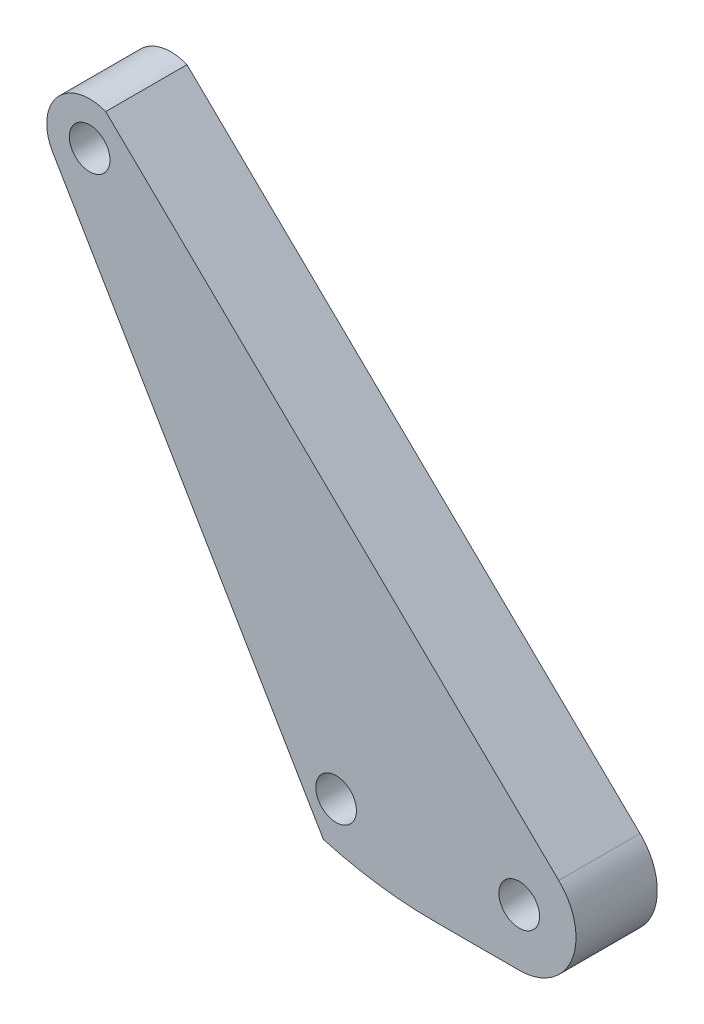
ISO-10303-21;
HEADER;
FILE_DESCRIPTION(('STEP AP214'),'2;1');
FILE_NAME('part.step','',(''),(''),'','','');
FILE_SCHEMA(('AUTOMOTIVE_DESIGN { 1 0 10303 214 1 1 1 1 }'));
ENDSEC;
DATA;
#1=APPLICATION_CONTEXT('core data for automotive mechanical design processes');
#2=APPLICATION_PROTOCOL_DEFINITION('international standard','automotive_design',2000,#1);
#3=PRODUCT_CONTEXT('',#1,'mechanical');
#4=PRODUCT('Part','Part','',(#3));
#5=PRODUCT_RELATED_PRODUCT_CATEGORY('part','',(#4));
#6=PRODUCT_DEFINITION_FORMATION('','',#4);
#7=PRODUCT_DEFINITION_CONTEXT('part definition',#1,'design');
#8=PRODUCT_DEFINITION('design','',#6,#7);
#9=PRODUCT_DEFINITION_SHAPE('','',#8);
#10=(LENGTH_UNIT() NAMED_UNIT(*) SI_UNIT(.MILLI.,.METRE.));
#11=(NAMED_UNIT(*) PLANE_ANGLE_UNIT() SI_UNIT($,.RADIAN.));
#12=(NAMED_UNIT(*) SI_UNIT($,.STERADIAN.) SOLID_ANGLE_UNIT());
#13=UNCERTAINTY_MEASURE_WITH_UNIT(LENGTH_MEASURE(1.E-05),#10,'distance_accuracy_value','');
#14=(GEOMETRIC_REPRESENTATION_CONTEXT(3) GLOBAL_UNCERTAINTY_ASSIGNED_CONTEXT((#13)) GLOBAL_UNIT_ASSIGNED_CONTEXT((#10,
#11,#12)) REPRESENTATION_CONTEXT('',''));
#15=CARTESIAN_POINT('',(0.,0.,0.));
#16=DIRECTION('',(0.,0.,1.));
#17=DIRECTION('',(1.,0.,0.));
#18=AXIS2_PLACEMENT_3D('',#15,#16,#17);
#19=CARTESIAN_POINT('',(-1.81475303851035,15.1962675797824,4.));
#20=DIRECTION('',(0.,0.,1.));
#21=DIRECTION('',(1.,0.,0.));
#22=AXIS2_PLACEMENT_3D('',#19,#20,#21);
#23=PLANE('',#22);
#24=CARTESIAN_POINT('',(2.36936185913628,-1.98601487246033,4.));
#25=DIRECTION('',(0.,0.,1.));
#26=DIRECTION('',(1.,0.,0.));
#27=AXIS2_PLACEMENT_3D('',#24,#25,#26);
#28=CIRCLE('',#27,1.);
#29=CARTESIAN_POINT('',(3.36936185913628,-1.98601487246033,4.));
#30=VERTEX_POINT('',#29);
#31=EDGE_CURVE('E183',#30,#30,#28,.T.);
#32=ORIENTED_EDGE('',*,*,#31,.F.);
#33=EDGE_LOOP('',(#32));
#34=FACE_BOUND('',#33,.T.);
#35=CARTESIAN_POINT('',(-1.81475303851035,15.1962675797824,4.));
#36=DIRECTION('',(0.,0.,1.));
#37=DIRECTION('',(1.,0.,0.));
#38=AXIS2_PLACEMENT_3D('',#35,#36,#37);
#39=CIRCLE('',#38,19.976772735065);
#40=CARTESIAN_POINT('',(-7.26548802719962,-4.02249765088515,4.));
#41=VERTEX_POINT('',#40);
#42=CARTESIAN_POINT('',(-1.81475303851033,-4.78050515528262,4.));
#43=VERTEX_POINT('',#42);
#44=EDGE_CURVE('E128',#41,#43,#39,.T.);
#45=ORIENTED_EDGE('',*,*,#44,.T.);
#46=DIRECTION('',(1.,0.,0.));
#47=VECTOR('',#46,1.);
#48=CARTESIAN_POINT('',(2.36936185913628,-4.78050515528262,4.));
#49=LINE('',#48,#47);
#50=CARTESIAN_POINT('',(2.36936185913628,-4.78050515528262,4.));
#51=VERTEX_POINT('',#50);
#52=EDGE_CURVE('E86',#43,#51,#49,.T.);
#53=ORIENTED_EDGE('',*,*,#52,.T.);
#54=CARTESIAN_POINT('',(2.36936185913628,-1.98601487246033,4.));
#55=DIRECTION('',(0.,0.,1.));
#56=DIRECTION('',(1.,0.,0.));
#57=AXIS2_PLACEMENT_3D('',#54,#55,#56);
#58=CIRCLE('',#57,2.79449028282229);
#59=CARTESIAN_POINT('',(4.31470222230882,0.0201822295712623,4.));
#60=VERTEX_POINT('',#59);
#61=EDGE_CURVE('E99',#51,#60,#58,.T.);
#62=ORIENTED_EDGE('',*,*,#61,.T.);
#63=DIRECTION('',(-0.717911640045294,0.696134237835977,0.));
#64=VECTOR('',#63,1.);
#65=CARTESIAN_POINT('',(-17.9779953156781,21.6366446802085,4.));
#66=LINE('',#65,#64);
#67=CARTESIAN_POINT('',(-17.9779953156781,21.6366446802085,4.));
#68=VERTEX_POINT('',#67);
#69=EDGE_CURVE('E93',#60,#68,#66,.T.);
#70=ORIENTED_EDGE('',*,*,#69,.T.);
#71=CARTESIAN_POINT('',(-18.7659280561654,19.6762430961428,4.));
#72=DIRECTION('',(0.,0.,1.));
#73=DIRECTION('',(1.,0.,0.));
#74=AXIS2_PLACEMENT_3D('',#71,#72,#73);
#75=CIRCLE('',#74,2.11282095179384);
#76=CARTESIAN_POINT('',(-20.5866446504047,18.6043273075658,4.));
#77=VERTEX_POINT('',#76);
#78=EDGE_CURVE('E97',#68,#77,#75,.T.);
#79=ORIENTED_EDGE('',*,*,#78,.T.);
#80=DIRECTION('',(0.507338678020431,-0.861746752697381,0.));
#81=VECTOR('',#80,1.);
#82=CARTESIAN_POINT('',(-20.5866446504047,18.6043273075658,4.));
#83=LINE('',#82,#81);
#84=EDGE_CURVE('E49',#77,#41,#83,.T.);
#85=ORIENTED_EDGE('',*,*,#84,.T.);
#86=EDGE_LOOP('',(#45,#53,#62,#70,#79,#85));
#87=FACE_BOUND('',#86,.T.);
#88=CARTESIAN_POINT('',(-6.64094739236276,-1.98601487246033,4.));
#89=DIRECTION('',(0.,0.,1.));
#90=DIRECTION('',(1.,0.,0.));
#91=AXIS2_PLACEMENT_3D('',#88,#89,#90);
#92=CIRCLE('',#91,1.);
#93=CARTESIAN_POINT('',(-5.64094739236276,-1.98601487246033,4.));
#94=VERTEX_POINT('',#93);
#95=EDGE_CURVE('E121',#94,#94,#92,.T.);
#96=ORIENTED_EDGE('',*,*,#95,.F.);
#97=EDGE_LOOP('',(#96));
#98=FACE_BOUND('',#97,.T.);
#99=CARTESIAN_POINT('',(-18.7659280561654,19.6762430961428,4.));
#100=DIRECTION('',(0.,0.,1.));
#101=DIRECTION('',(1.,0.,0.));
#102=AXIS2_PLACEMENT_3D('',#99,#100,#101);
#103=CIRCLE('',#102,1.);
#104=CARTESIAN_POINT('',(-17.7659280561654,19.6762430961428,4.));
#105=VERTEX_POINT('',#104);
#106=EDGE_CURVE('E174',#105,#105,#103,.T.);
#107=ORIENTED_EDGE('',*,*,#106,.F.);
#108=EDGE_LOOP('',(#107));
#109=FACE_BOUND('',#108,.T.);
#110=ADVANCED_FACE('F32',(#34,#87,#98,#109),#23,.T.);
#111=CARTESIAN_POINT('',(-1.81475303851035,15.1962675797824,0.));
#112=DIRECTION('',(0.,0.,1.));
#113=DIRECTION('',(1.,0.,0.));
#114=AXIS2_PLACEMENT_3D('',#111,#112,#113);
#115=PLANE('',#114);
#116=CARTESIAN_POINT('',(-1.81475303851035,15.1962675797824,0.));
#117=DIRECTION('',(0.,0.,1.));
#118=DIRECTION('',(1.,0.,0.));
#119=AXIS2_PLACEMENT_3D('',#116,#117,#118);
#120=CIRCLE('',#119,19.976772735065);
#121=CARTESIAN_POINT('',(-7.26548802719962,-4.02249765088515,0.));
#122=VERTEX_POINT('',#121);
#123=CARTESIAN_POINT('',(-1.81475303851033,-4.78050515528262,0.));
#124=VERTEX_POINT('',#123);
#125=EDGE_CURVE('E117',#122,#124,#120,.T.);
#126=ORIENTED_EDGE('',*,*,#125,.F.);
#127=DIRECTION('',(0.507338678020431,-0.861746752697381,0.));
#128=VECTOR('',#127,1.);
#129=CARTESIAN_POINT('',(-20.5866446504047,18.6043273075658,0.));
#130=LINE('',#129,#128);
#131=CARTESIAN_POINT('',(-20.5866446504047,18.6043273075658,0.));
#132=VERTEX_POINT('',#131);
#133=EDGE_CURVE('E78',#132,#122,#130,.T.);
#134=ORIENTED_EDGE('',*,*,#133,.F.);
#135=CARTESIAN_POINT('',(-18.7659280561654,19.6762430961428,0.));
#136=DIRECTION('',(0.,0.,1.));
#137=DIRECTION('',(1.,0.,0.));
#138=AXIS2_PLACEMENT_3D('',#135,#136,#137);
#139=CIRCLE('',#138,2.11282095179384);
#140=CARTESIAN_POINT('',(-17.9779953156781,21.6366446802085,0.));
#141=VERTEX_POINT('',#140);
#142=EDGE_CURVE('E72',#141,#132,#139,.T.);
#143=ORIENTED_EDGE('',*,*,#142,.F.);
#144=DIRECTION('',(-0.717911640045294,0.696134237835977,0.));
#145=VECTOR('',#144,1.);
#146=CARTESIAN_POINT('',(-17.9779953156781,21.6366446802085,0.));
#147=LINE('',#146,#145);
#148=CARTESIAN_POINT('',(4.31470222230882,0.0201822295712623,0.));
#149=VERTEX_POINT('',#148);
#150=EDGE_CURVE('E107',#149,#141,#147,.T.);
#151=ORIENTED_EDGE('',*,*,#150,.F.);
#152=CARTESIAN_POINT('',(2.36936185913628,-1.98601487246033,0.));
#153=DIRECTION('',(0.,0.,1.));
#154=DIRECTION('',(1.,0.,0.));
#155=AXIS2_PLACEMENT_3D('',#152,#153,#154);
#156=CIRCLE('',#155,2.79449028282229);
#157=CARTESIAN_POINT('',(2.36936185913628,-4.78050515528262,0.));
#158=VERTEX_POINT('',#157);
#159=EDGE_CURVE('E123',#158,#149,#156,.T.);
#160=ORIENTED_EDGE('',*,*,#159,.F.);
#161=DIRECTION('',(1.,0.,0.));
#162=VECTOR('',#161,1.);
#163=CARTESIAN_POINT('',(2.36936185913628,-4.78050515528262,0.));
#164=LINE('',#163,#162);
#165=EDGE_CURVE('E120',#124,#158,#164,.T.);
#166=ORIENTED_EDGE('',*,*,#165,.F.);
#167=EDGE_LOOP('',(#126,#134,#143,#151,#160,#166));
#168=FACE_BOUND('',#167,.T.);
#169=CARTESIAN_POINT('',(-6.64094739236276,-1.98601487246033,0.));
#170=DIRECTION('',(0.,0.,1.));
#171=DIRECTION('',(1.,0.,0.));
#172=AXIS2_PLACEMENT_3D('',#169,#170,#171);
#173=CIRCLE('',#172,1.);
#174=CARTESIAN_POINT('',(-5.64094739236276,-1.98601487246033,0.));
#175=VERTEX_POINT('',#174);
#176=EDGE_CURVE('E186',#175,#175,#173,.T.);
#177=ORIENTED_EDGE('',*,*,#176,.T.);
#178=EDGE_LOOP('',(#177));
#179=FACE_BOUND('',#178,.T.);
#180=CARTESIAN_POINT('',(2.36936185913628,-1.98601487246033,0.));
#181=DIRECTION('',(0.,0.,1.));
#182=DIRECTION('',(1.,0.,0.));
#183=AXIS2_PLACEMENT_3D('',#180,#181,#182);
#184=CIRCLE('',#183,1.);
#185=CARTESIAN_POINT('',(3.36936185913628,-1.98601487246033,0.));
#186=VERTEX_POINT('',#185);
#187=EDGE_CURVE('E180',#186,#186,#184,.T.);
#188=ORIENTED_EDGE('',*,*,#187,.T.);
#189=EDGE_LOOP('',(#188));
#190=FACE_BOUND('',#189,.T.);
#191=CARTESIAN_POINT('',(-18.7659280561654,19.6762430961428,0.));
#192=DIRECTION('',(0.,0.,1.));
#193=DIRECTION('',(1.,0.,0.));
#194=AXIS2_PLACEMENT_3D('',#191,#192,#193);
#195=CIRCLE('',#194,1.);
#196=CARTESIAN_POINT('',(-17.7659280561654,19.6762430961428,0.));
#197=VERTEX_POINT('',#196);
#198=EDGE_CURVE('E177',#197,#197,#195,.T.);
#199=ORIENTED_EDGE('',*,*,#198,.T.);
#200=EDGE_LOOP('',(#199));
#201=FACE_BOUND('',#200,.T.);
#202=ADVANCED_FACE('F137',(#168,#179,#190,#201),#115,.F.);
#203=CARTESIAN_POINT('',(-1.81475303851035,15.1962675797824,4.));
#204=DIRECTION('',(0.,0.,-1.));
#205=DIRECTION('',(-1.,0.,0.));
#206=AXIS2_PLACEMENT_3D('',#203,#204,#205);
#207=CYLINDRICAL_SURFACE('',#206,19.976772735065);
#208=ORIENTED_EDGE('',*,*,#125,.T.);
#209=DIRECTION('',(0.,0.,-1.));
#210=VECTOR('',#209,1.);
#211=CARTESIAN_POINT('',(-1.81475303851033,-4.78050515528262,4.));
#212=LINE('',#211,#210);
#213=EDGE_CURVE('E11',#43,#124,#212,.T.);
#214=ORIENTED_EDGE('',*,*,#213,.F.);
#215=ORIENTED_EDGE('',*,*,#44,.F.);
#216=DIRECTION('',(0.,0.,-1.));
#217=VECTOR('',#216,1.);
#218=CARTESIAN_POINT('',(-7.26548802719962,-4.02249765088515,4.));
#219=LINE('',#218,#217);
#220=EDGE_CURVE('E113',#41,#122,#219,.T.);
#221=ORIENTED_EDGE('',*,*,#220,.T.);
#222=EDGE_LOOP('',(#208,#214,#215,#221));
#223=FACE_BOUND('',#222,.T.);
#224=ADVANCED_FACE('F34',(#223),#207,.T.);
#225=CARTESIAN_POINT('',(2.36936185913628,-4.78050515528262,4.));
#226=DIRECTION('',(0.,1.,0.));
#227=DIRECTION('',(-1.,0.,0.));
#228=AXIS2_PLACEMENT_3D('',#225,#226,#227);
#229=PLANE('',#228);
#230=ORIENTED_EDGE('',*,*,#165,.T.);
#231=DIRECTION('',(0.,0.,-1.));
#232=VECTOR('',#231,1.);
#233=CARTESIAN_POINT('',(2.36936185913628,-4.78050515528262,4.));
#234=LINE('',#233,#232);
#235=EDGE_CURVE('E41',#51,#158,#234,.T.);
#236=ORIENTED_EDGE('',*,*,#235,.F.);
#237=ORIENTED_EDGE('',*,*,#52,.F.);
#238=ORIENTED_EDGE('',*,*,#213,.T.);
#239=EDGE_LOOP('',(#230,#236,#237,#238));
#240=FACE_BOUND('',#239,.T.);
#241=ADVANCED_FACE('F236',(#240),#229,.F.);
#242=CARTESIAN_POINT('',(2.36936185913628,-1.98601487246033,4.));
#243=DIRECTION('',(0.,0.,-1.));
#244=DIRECTION('',(-1.,0.,0.));
#245=AXIS2_PLACEMENT_3D('',#242,#243,#244);
#246=CYLINDRICAL_SURFACE('',#245,2.79449028282229);
#247=ORIENTED_EDGE('',*,*,#159,.T.);
#248=DIRECTION('',(0.,0.,-1.));
#249=VECTOR('',#248,1.);
#250=CARTESIAN_POINT('',(4.31470222230882,0.0201822295712623,4.));
#251=LINE('',#250,#249);
#252=EDGE_CURVE('E108',#60,#149,#251,.T.);
#253=ORIENTED_EDGE('',*,*,#252,.F.);
#254=ORIENTED_EDGE('',*,*,#61,.F.);
#255=ORIENTED_EDGE('',*,*,#235,.T.);
#256=EDGE_LOOP('',(#247,#253,#254,#255));
#257=FACE_BOUND('',#256,.T.);
#258=ADVANCED_FACE('F134',(#257),#246,.T.);
#259=CARTESIAN_POINT('',(-17.9779953156781,21.6366446802085,4.));
#260=DIRECTION('',(-0.696134237835977,-0.717911640045294,0.));
#261=DIRECTION('',(0.717911640045294,-0.696134237835977,0.));
#262=AXIS2_PLACEMENT_3D('',#259,#260,#261);
#263=PLANE('',#262);
#264=ORIENTED_EDGE('',*,*,#150,.T.);
#265=DIRECTION('',(0.,0.,-1.));
#266=VECTOR('',#265,1.);
#267=CARTESIAN_POINT('',(-17.9779953156781,21.6366446802085,4.));
#268=LINE('',#267,#266);
#269=EDGE_CURVE('E104',#68,#141,#268,.T.);
#270=ORIENTED_EDGE('',*,*,#269,.F.);
#271=ORIENTED_EDGE('',*,*,#69,.F.);
#272=ORIENTED_EDGE('',*,*,#252,.T.);
#273=EDGE_LOOP('',(#264,#270,#271,#272));
#274=FACE_BOUND('',#273,.T.);
#275=ADVANCED_FACE('F105',(#274),#263,.F.);
#276=CARTESIAN_POINT('',(-18.7659280561654,19.6762430961428,4.));
#277=DIRECTION('',(0.,0.,-1.));
#278=DIRECTION('',(-1.,0.,0.));
#279=AXIS2_PLACEMENT_3D('',#276,#277,#278);
#280=CYLINDRICAL_SURFACE('',#279,2.11282095179384);
#281=ORIENTED_EDGE('',*,*,#142,.T.);
#282=DIRECTION('',(0.,0.,-1.));
#283=VECTOR('',#282,1.);
#284=CARTESIAN_POINT('',(-20.5866446504047,18.6043273075658,4.));
#285=LINE('',#284,#283);
#286=EDGE_CURVE('E109',#77,#132,#285,.T.);
#287=ORIENTED_EDGE('',*,*,#286,.F.);
#288=ORIENTED_EDGE('',*,*,#78,.F.);
#289=ORIENTED_EDGE('',*,*,#269,.T.);
#290=EDGE_LOOP('',(#281,#287,#288,#289));
#291=FACE_BOUND('',#290,.T.);
#292=ADVANCED_FACE('F111',(#291),#280,.T.);
#293=CARTESIAN_POINT('',(-20.5866446504047,18.6043273075658,4.));
#294=DIRECTION('',(0.861746752697381,0.507338678020431,0.));
#295=DIRECTION('',(-0.507338678020431,0.861746752697381,0.));
#296=AXIS2_PLACEMENT_3D('',#293,#294,#295);
#297=PLANE('',#296);
#298=ORIENTED_EDGE('',*,*,#133,.T.);
#299=ORIENTED_EDGE('',*,*,#220,.F.);
#300=ORIENTED_EDGE('',*,*,#84,.F.);
#301=ORIENTED_EDGE('',*,*,#286,.T.);
#302=EDGE_LOOP('',(#298,#299,#300,#301));
#303=FACE_BOUND('',#302,.T.);
#304=ADVANCED_FACE('F142',(#303),#297,.F.);
#305=CARTESIAN_POINT('',(-6.64094739236276,-1.98601487246033,4.));
#306=DIRECTION('',(0.,0.,-1.));
#307=DIRECTION('',(-1.,0.,0.));
#308=AXIS2_PLACEMENT_3D('',#305,#306,#307);
#309=CYLINDRICAL_SURFACE('',#308,1.);
#310=ORIENTED_EDGE('',*,*,#95,.T.);
#311=EDGE_LOOP('',(#310));
#312=FACE_BOUND('',#311,.T.);
#313=ORIENTED_EDGE('',*,*,#176,.F.);
#314=EDGE_LOOP('',(#313));
#315=FACE_BOUND('',#314,.T.);
#316=ADVANCED_FACE('F144',(#312,#315),#309,.F.);
#317=CARTESIAN_POINT('',(2.36936185913628,-1.98601487246033,4.));
#318=DIRECTION('',(0.,0.,-1.));
#319=DIRECTION('',(-1.,0.,0.));
#320=AXIS2_PLACEMENT_3D('',#317,#318,#319);
#321=CYLINDRICAL_SURFACE('',#320,1.);
#322=ORIENTED_EDGE('',*,*,#31,.T.);
#323=EDGE_LOOP('',(#322));
#324=FACE_BOUND('',#323,.T.);
#325=ORIENTED_EDGE('',*,*,#187,.F.);
#326=EDGE_LOOP('',(#325));
#327=FACE_BOUND('',#326,.T.);
#328=ADVANCED_FACE('F150',(#324,#327),#321,.F.);
#329=CARTESIAN_POINT('',(-18.7659280561654,19.6762430961428,4.));
#330=DIRECTION('',(0.,0.,-1.));
#331=DIRECTION('',(-1.,0.,0.));
#332=AXIS2_PLACEMENT_3D('',#329,#330,#331);
#333=CYLINDRICAL_SURFACE('',#332,1.);
#334=ORIENTED_EDGE('',*,*,#106,.T.);
#335=EDGE_LOOP('',(#334));
#336=FACE_BOUND('',#335,.T.);
#337=ORIENTED_EDGE('',*,*,#198,.F.);
#338=EDGE_LOOP('',(#337));
#339=FACE_BOUND('',#338,.T.);
#340=ADVANCED_FACE('F165',(#336,#339),#333,.F.);
#341=CLOSED_SHELL('',(#110,#202,#224,#241,#258,#275,#292,#304,#316,#328,#340));
#342=MANIFOLD_SOLID_BREP('B2',#341);
#343=ADVANCED_BREP_SHAPE_REPRESENTATION('',(#18,#342),#14);
#344=SHAPE_DEFINITION_REPRESENTATION(#9,#343);
ENDSEC;
END-ISO-10303-21;
